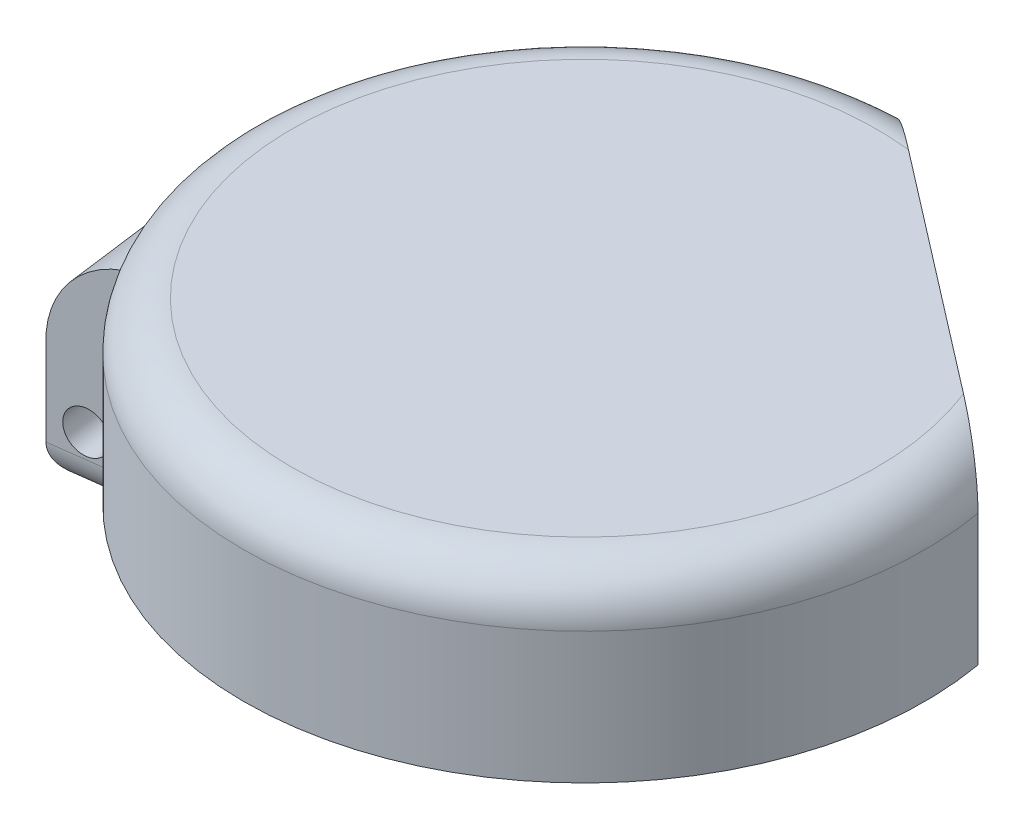
ISO-10303-21;
HEADER;
FILE_DESCRIPTION(('STEP AP214'),'2;1');
FILE_NAME('part.step','',(''),(''),'','','');
FILE_SCHEMA(('AUTOMOTIVE_DESIGN { 1 0 10303 214 1 1 1 1 }'));
ENDSEC;
DATA;
#1=APPLICATION_CONTEXT('core data for automotive mechanical design processes');
#2=APPLICATION_PROTOCOL_DEFINITION('international standard','automotive_design',2000,#1);
#3=PRODUCT_CONTEXT('',#1,'mechanical');
#4=PRODUCT('Part','Part','',(#3));
#5=PRODUCT_RELATED_PRODUCT_CATEGORY('part','',(#4));
#6=PRODUCT_DEFINITION_FORMATION('','',#4);
#7=PRODUCT_DEFINITION_CONTEXT('part definition',#1,'design');
#8=PRODUCT_DEFINITION('design','',#6,#7);
#9=PRODUCT_DEFINITION_SHAPE('','',#8);
#10=(LENGTH_UNIT() NAMED_UNIT(*) SI_UNIT(.MILLI.,.METRE.));
#11=(NAMED_UNIT(*) PLANE_ANGLE_UNIT() SI_UNIT($,.RADIAN.));
#12=(NAMED_UNIT(*) SI_UNIT($,.STERADIAN.) SOLID_ANGLE_UNIT());
#13=UNCERTAINTY_MEASURE_WITH_UNIT(LENGTH_MEASURE(1.E-05),#10,'distance_accuracy_value','');
#14=(GEOMETRIC_REPRESENTATION_CONTEXT(3) GLOBAL_UNCERTAINTY_ASSIGNED_CONTEXT((#13)) GLOBAL_UNIT_ASSIGNED_CONTEXT((#10,
#11,#12)) REPRESENTATION_CONTEXT('',''));
#15=CARTESIAN_POINT('',(0.,0.,0.));
#16=DIRECTION('',(0.,0.,1.));
#17=DIRECTION('',(1.,0.,0.));
#18=AXIS2_PLACEMENT_3D('',#15,#16,#17);
#19=CARTESIAN_POINT('',(0.,15.,0.));
#20=DIRECTION('',(0.,-1.,0.));
#21=DIRECTION('',(0.,0.,-1.));
#22=AXIS2_PLACEMENT_3D('',#19,#20,#21);
#23=CYLINDRICAL_SURFACE('',#22,28.4999999999886);
#24=DIRECTION('',(0.,-1.,0.));
#25=VECTOR('',#24,1.);
#26=CARTESIAN_POINT('',(28.0773849307796,15.,-4.88983184252586));
#27=LINE('',#26,#25);
#28=CARTESIAN_POINT('',(28.0773849307796,11.,-4.88983184252586));
#29=VERTEX_POINT('',#28);
#30=CARTESIAN_POINT('',(28.0773849307796,0.,-4.88983184252586));
#31=VERTEX_POINT('',#30);
#32=EDGE_CURVE('E285',#29,#31,#27,.T.);
#33=ORIENTED_EDGE('',*,*,#32,.F.);
#34=CARTESIAN_POINT('',(0.,11.,0.));
#35=DIRECTION('',(0.,1.,0.));
#36=DIRECTION('',(0.,0.,1.));
#37=AXIS2_PLACEMENT_3D('',#34,#35,#36);
#38=CIRCLE('',#37,28.4999999999886);
#39=CARTESIAN_POINT('',(-2.46069205317304,11.,-28.393573121726));
#40=VERTEX_POINT('',#39);
#41=EDGE_CURVE('E354',#29,#40,#38,.F.);
#42=ORIENTED_EDGE('',*,*,#41,.T.);
#43=DIRECTION('',(0.,-1.,0.));
#44=VECTOR('',#43,1.);
#45=CARTESIAN_POINT('',(-2.46069205317304,15.,-28.393573121726));
#46=LINE('',#45,#44);
#47=CARTESIAN_POINT('',(-2.46069205317304,0.,-28.393573121726));
#48=VERTEX_POINT('',#47);
#49=EDGE_CURVE('E292',#40,#48,#46,.T.);
#50=ORIENTED_EDGE('',*,*,#49,.T.);
#51=CARTESIAN_POINT('',(0.,0.,0.));
#52=DIRECTION('',(0.,1.,0.));
#53=DIRECTION('',(0.,0.,1.));
#54=AXIS2_PLACEMENT_3D('',#51,#52,#53);
#55=CIRCLE('',#54,28.4999999999886);
#56=EDGE_CURVE('E286',#48,#31,#55,.T.);
#57=ORIENTED_EDGE('',*,*,#56,.T.);
#58=EDGE_LOOP('',(#33,#42,#50,#57));
#59=FACE_BOUND('',#58,.T.);
#60=DIRECTION('',(0.,-1.,0.));
#61=VECTOR('',#60,1.);
#62=CARTESIAN_POINT('',(-28.1278529108762,15.,-4.59063074353197));
#63=LINE('',#62,#61);
#64=CARTESIAN_POINT('',(-28.1278529108762,8.13280866111372,-4.59063074353197));
#65=VERTEX_POINT('',#64);
#66=CARTESIAN_POINT('',(-28.1278529108762,2.13280866111373,-4.59063074353197));
#67=VERTEX_POINT('',#66);
#68=EDGE_CURVE('E184',#65,#67,#63,.T.);
#69=ORIENTED_EDGE('',*,*,#68,.F.);
#70=CARTESIAN_POINT('',(0.,8.13280866111369,0.));
#71=DIRECTION('',(0.,-1.,0.));
#72=DIRECTION('',(1.,0.,0.));
#73=AXIS2_PLACEMENT_3D('',#70,#71,#72);
#74=CIRCLE('',#73,28.4999999999886);
#75=CARTESIAN_POINT('',(-28.2615823921877,8.13280866111373,3.67871726134734));
#76=VERTEX_POINT('',#75);
#77=EDGE_CURVE('E369',#76,#65,#74,.T.);
#78=ORIENTED_EDGE('',*,*,#77,.F.);
#79=CARTESIAN_POINT('',(-26.6925412667941,8.13280866111374,9.98790472120371));
#80=VERTEX_POINT('',#79);
#81=EDGE_CURVE('E366',#80,#76,#74,.T.);
#82=ORIENTED_EDGE('',*,*,#81,.F.);
#83=DIRECTION('',(0.,-1.,0.));
#84=VECTOR('',#83,1.);
#85=CARTESIAN_POINT('',(-26.6925412667941,15.,9.9879047212037));
#86=LINE('',#85,#84);
#87=CARTESIAN_POINT('',(-26.6925412667941,2.13280866111374,9.9879047212037));
#88=VERTEX_POINT('',#87);
#89=EDGE_CURVE('E359',#80,#88,#86,.T.);
#90=ORIENTED_EDGE('',*,*,#89,.T.);
#91=CARTESIAN_POINT('',(0.,2.13280866111375,0.));
#92=DIRECTION('',(0.,1.,0.));
#93=DIRECTION('',(-1.,0.,0.));
#94=AXIS2_PLACEMENT_3D('',#91,#92,#93);
#95=CIRCLE('',#94,28.4999999999886);
#96=CARTESIAN_POINT('',(-28.2615823921877,2.13280866111373,3.67871726134734));
#97=VERTEX_POINT('',#96);
#98=EDGE_CURVE('E361',#97,#88,#95,.T.);
#99=ORIENTED_EDGE('',*,*,#98,.F.);
#100=EDGE_CURVE('E367',#67,#97,#95,.T.);
#101=ORIENTED_EDGE('',*,*,#100,.F.);
#102=EDGE_LOOP('',(#69,#78,#82,#90,#99,#101));
#103=FACE_BOUND('',#102,.T.);
#104=ADVANCED_FACE('F39',(#59,#103),#23,.T.);
#105=CARTESIAN_POINT('',(23.1864899240637,15.,-8.65412685435615));
#106=DIRECTION('',(-0.609921258990632,0.,0.792462022958377));
#107=DIRECTION('',(0.792462022958377,0.,0.609921258990632));
#108=AXIS2_PLACEMENT_3D('',#105,#106,#107);
#109=PLANE('',#108);
#110=DIRECTION('',(-0.792462022958376,0.,-0.609921258990633));
#111=VECTOR('',#110,1.);
#112=CARTESIAN_POINT('',(23.1864899240637,15.,-8.65412685435615));
#113=LINE('',#112,#111);
#114=CARTESIAN_POINT('',(22.8087650405059,15.,-8.94484417563749));
#115=VERTEX_POINT('',#114);
#116=CARTESIAN_POINT('',(2.80792783710069,15.,-24.3385607886143));
#117=VERTEX_POINT('',#116);
#118=EDGE_CURVE('E282',#115,#117,#113,.T.);
#119=ORIENTED_EDGE('',*,*,#118,.F.);
#120=CARTESIAN_POINT('',(22.8087650405059,15.,-8.94484417563749));
#121=CARTESIAN_POINT('',(22.9197151819075,14.9999966218736,-8.85945099846509));
#122=CARTESIAN_POINT('',(23.030662100096,14.9980499476528,-8.77406030205036));
#123=CARTESIAN_POINT('',(23.2524842215523,14.9899576648635,-8.60333410486868));
#124=CARTESIAN_POINT('',(23.3633594022338,14.9838110830384,-8.51799862148532));
#125=CARTESIAN_POINT('',(23.6964778755162,14.9585451580046,-8.26161278502726));
#126=CARTESIAN_POINT('',(23.9184357633951,14.9325951780306,-8.09078209472793));
#127=CARTESIAN_POINT('',(24.3634352939433,14.8591378204923,-7.74828659833935));
#128=CARTESIAN_POINT('',(24.5864454900354,14.8113214027466,-7.57664599522194));
#129=CARTESIAN_POINT('',(25.027948014718,14.6906226623751,-7.23684198203192));
#130=CARTESIAN_POINT('',(25.2464471832023,14.6177817790417,-7.06867330761033));
#131=CARTESIAN_POINT('',(25.5690157731485,14.4865492406019,-6.82040722697676));
#132=CARTESIAN_POINT('',(25.6758833788836,14.4390262284403,-6.73815618812956));
#133=CARTESIAN_POINT('',(25.8872000304859,14.3360850746214,-6.57551556377537));
#134=CARTESIAN_POINT('',(25.9916488817492,14.280666300249,-6.49512612804593));
#135=CARTESIAN_POINT('',(26.2998023173756,14.1020205169576,-6.25795472301396));
#136=CARTESIAN_POINT('',(26.4991100296383,13.9660923303716,-6.10455682220851));
#137=CARTESIAN_POINT('',(26.8470589684213,13.6813822138625,-5.83675666439812));
#138=CARTESIAN_POINT('',(26.9986462283465,13.5383747072633,-5.72008698213958));
#139=CARTESIAN_POINT('',(27.2818858247614,13.2234515219114,-5.50209060346588));
#140=CARTESIAN_POINT('',(27.4135595559255,13.0515672930293,-5.4007474405623));
#141=CARTESIAN_POINT('',(27.6183868834771,12.7266417335124,-5.24310134790839));
#142=CARTESIAN_POINT('',(27.6978919641955,12.5800435610043,-5.18190997529616));
#143=CARTESIAN_POINT('',(27.8021583656245,12.3496148814372,-5.10166096274085));
#144=CARTESIAN_POINT('',(27.8343989233107,12.2711054623945,-5.0768469010384));
#145=CARTESIAN_POINT('',(27.8934180514728,12.1108996479084,-5.03142261582308));
#146=CARTESIAN_POINT('',(27.9201992570465,12.0292048127812,-5.01081036419771));
#147=CARTESIAN_POINT('',(27.9656342771095,11.8707478106625,-4.97584113685775));
#148=CARTESIAN_POINT('',(27.9848091077193,11.7942232157571,-4.96108315920379));
#149=CARTESIAN_POINT('',(28.0179544516386,11.6394055753678,-4.93557272550817));
#150=CARTESIAN_POINT('',(28.031925874673,11.5611128415532,-4.92481956929358));
#151=CARTESIAN_POINT('',(28.0544984312568,11.4027067311063,-4.90744651956835));
#152=CARTESIAN_POINT('',(28.0630594592146,11.3225842168674,-4.90085749347117));
#153=CARTESIAN_POINT('',(28.0745140399743,11.1616449238521,-4.89204143400617));
#154=CARTESIAN_POINT('',(28.0774038373428,11.0808277206052,-4.88981729102119));
#155=CARTESIAN_POINT('',(28.0773849307796,11.,-4.88983184252585));
#156=B_SPLINE_CURVE_WITH_KNOTS('',3,(#120,#121,#122,#123,#124,#125,#126,#127,#128,#129,#130,
#131,#132,#133,#134,#135,#136,#137,#138,#139,#140,#141,#142,#143,#144,#145,#146,#147,#148,#149,
#150,#151,#152,#153,#154,#155),.UNSPECIFIED.,.F.,.F.,(4,2,2,2,2,2,2,2,2,2,2,2,2,2,2,2,2,4),(0.,
0.419993858932493,0.840085077265771,1.68320900562935,2.53863580132238,3.39265282596669,
3.82137630782058,4.25013416413614,5.10451429020874,5.81862018224171,6.53195331867824,
7.06264908846479,7.32764680496837,7.5925163090072,7.83302011446851,8.07348185228879,
8.31570577354576,8.55809003906211),.UNSPECIFIED.);
#157=EDGE_CURVE('E305',#115,#29,#156,.T.);
#158=ORIENTED_EDGE('',*,*,#157,.T.);
#159=ORIENTED_EDGE('',*,*,#32,.T.);
#160=DIRECTION('',(-0.792462022958377,0.,-0.609921258990632));
#161=VECTOR('',#160,1.);
#162=CARTESIAN_POINT('',(23.1864899240637,0.,-8.65412685435615));
#163=LINE('',#162,#161);
#164=EDGE_CURVE('E275',#31,#48,#163,.T.);
#165=ORIENTED_EDGE('',*,*,#164,.T.);
#166=ORIENTED_EDGE('',*,*,#49,.F.);
#167=CARTESIAN_POINT('',(-2.46069205317304,11.,-28.393573121726));
#168=CARTESIAN_POINT('',(-2.4607156423846,11.0862161322655,-28.3935912772479));
#169=CARTESIAN_POINT('',(-2.45742550100494,11.1724161815989,-28.3910590080483));
#170=CARTESIAN_POINT('',(-2.44439928729485,11.3439734980434,-28.381033335605));
#171=CARTESIAN_POINT('',(-2.43466811258324,11.4293313555279,-28.3735437018313));
#172=CARTESIAN_POINT('',(-2.40904974542677,11.5978108015038,-28.3538264329948));
#173=CARTESIAN_POINT('',(-2.39321535921455,11.6809452033704,-28.3416394404398));
#174=CARTESIAN_POINT('',(-2.35571771865815,11.84507755699,-28.3127792459135));
#175=CARTESIAN_POINT('',(-2.33405368104359,11.9260752200443,-28.2961054410952));
#176=CARTESIAN_POINT('',(-2.26101925867176,12.164563045356,-28.2398942340567));
#177=CARTESIAN_POINT('',(-2.20150577539929,12.3181837739575,-28.1940894666447));
#178=CARTESIAN_POINT('',(-2.06433970649324,12.6120540336859,-28.0885191061551));
#179=CARTESIAN_POINT('',(-1.98664642733391,12.7522725588133,-28.0287221931585));
#180=CARTESIAN_POINT('',(-1.78230805037165,13.0718455951133,-27.8714524230922));
#181=CARTESIAN_POINT('',(-1.64859150859841,13.2439955949161,-27.768537003623));
#182=CARTESIAN_POINT('',(-1.36120145108757,13.559062087377,-27.5473462075719));
#183=CARTESIAN_POINT('',(-1.20750022600024,13.7019372676517,-27.429049504389));
#184=CARTESIAN_POINT('',(-0.927292090048359,13.9277245569317,-27.2133863002127));
#185=CARTESIAN_POINT('',(-0.803762449459978,14.0166573365107,-27.1183112660438));
#186=CARTESIAN_POINT('',(-0.550977936804274,14.1806062060654,-26.923754752614));
#187=CARTESIAN_POINT('',(-0.421720083057594,14.2556149402761,-26.8242709784929));
#188=CARTESIAN_POINT('',(-0.158460138519076,14.3931262216248,-26.6216520110686));
#189=CARTESIAN_POINT('',(-0.0244395147322575,14.455571701349,-26.5185025537791));
#190=CARTESIAN_POINT('',(0.24669788349581,14.5686977449325,-26.3098206756629));
#191=CARTESIAN_POINT('',(0.383815570205059,14.6193747913667,-26.2042875527059));
#192=CARTESIAN_POINT('',(0.709709094653672,14.7262288220219,-25.9534624242202));
#193=CARTESIAN_POINT('',(0.899414930951102,14.7778863854278,-25.8074546419413));
#194=CARTESIAN_POINT('',(1.28136414768974,14.8638483663483,-25.5134860473655));
#195=CARTESIAN_POINT('',(1.47360932582749,14.8981397302905,-25.3655238514651));
#196=CARTESIAN_POINT('',(1.85614305906951,14.9509737715118,-25.0711053816508));
#197=CARTESIAN_POINT('',(2.04641017150667,14.9697715254074,-24.9246656111631));
#198=CARTESIAN_POINT('',(2.42712138211621,14.9942541931097,-24.6316498524774));
#199=CARTESIAN_POINT('',(2.61756444759768,14.9999640915793,-24.4850746590935));
#200=CARTESIAN_POINT('',(2.80792783710067,15.,-24.3385607886143));
#201=B_SPLINE_CURVE_WITH_KNOTS('',3,(#167,#168,#169,#170,#171,#172,#173,#174,#175,#176,#177,
#178,#179,#180,#181,#182,#183,#184,#185,#186,#187,#188,#189,#190,#191,#192,#193,#194,#195,#196,
#197,#198,#199,#200),.UNSPECIFIED.,.F.,.F.,(4,2,2,2,2,2,2,2,2,2,2,2,2,2,2,2,4),(0.,
0.258522296473451,0.516848243804886,0.772987533788175,1.02916125577529,1.53959039014347,
2.05117318362961,2.7703261211216,3.49048703581486,4.02817460031106,4.56614540988481,
5.10650731134746,5.64703051237305,6.38094554411315,7.11541141867153,7.83752935623398,
8.55826762137591),.UNSPECIFIED.);
#202=EDGE_CURVE('E297',#40,#117,#201,.T.);
#203=ORIENTED_EDGE('',*,*,#202,.T.);
#204=EDGE_LOOP('',(#119,#158,#159,#165,#166,#203));
#205=FACE_BOUND('',#204,.T.);
#206=ADVANCED_FACE('F313',(#205),#109,.F.);
#207=CARTESIAN_POINT('',(0.,15.,0.));
#208=DIRECTION('',(0.,1.,0.));
#209=DIRECTION('',(0.,0.,1.));
#210=AXIS2_PLACEMENT_3D('',#207,#208,#209);
#211=PLANE('',#210);
#212=ORIENTED_EDGE('',*,*,#118,.T.);
#213=CARTESIAN_POINT('',(0.,15.,0.));
#214=DIRECTION('',(0.,1.,0.));
#215=DIRECTION('',(0.,0.,1.));
#216=AXIS2_PLACEMENT_3D('',#213,#214,#215);
#217=CIRCLE('',#216,24.4999999999886);
#218=EDGE_CURVE('E294',#117,#115,#217,.T.);
#219=ORIENTED_EDGE('',*,*,#218,.T.);
#220=EDGE_LOOP('',(#212,#219));
#221=FACE_BOUND('',#220,.T.);
#222=ADVANCED_FACE('F317',(#221),#211,.T.);
#223=CARTESIAN_POINT('',(0.,0.,0.));
#224=DIRECTION('',(0.,1.,0.));
#225=DIRECTION('',(0.,0.,1.));
#226=AXIS2_PLACEMENT_3D('',#223,#224,#225);
#227=PLANE('',#226);
#228=CARTESIAN_POINT('',(0.,0.,0.));
#229=DIRECTION('',(0.,1.,0.));
#230=DIRECTION('',(0.,0.,1.));
#231=AXIS2_PLACEMENT_3D('',#228,#229,#230);
#232=CIRCLE('',#231,26.4999999999886);
#233=CARTESIAN_POINT('',(-3.05060994356709,0.,-26.323825310384));
#234=VERTEX_POINT('',#233);
#235=CARTESIAN_POINT('',(26.2276177852111,0.,-3.78973156203436));
#236=VERTEX_POINT('',#235);
#237=EDGE_CURVE('E242',#234,#236,#232,.T.);
#238=ORIENTED_EDGE('',*,*,#237,.T.);
#239=DIRECTION('',(-0.792462022958377,0.,-0.609921258990632));
#240=VECTOR('',#239,1.);
#241=CARTESIAN_POINT('',(21.9666474060824,0.,-7.06920280843939));
#242=LINE('',#241,#240);
#243=EDGE_CURVE('E237',#236,#234,#242,.T.);
#244=ORIENTED_EDGE('',*,*,#243,.T.);
#245=EDGE_LOOP('',(#238,#244));
#246=FACE_BOUND('',#245,.T.);
#247=ORIENTED_EDGE('',*,*,#164,.F.);
#248=ORIENTED_EDGE('',*,*,#56,.F.);
#249=EDGE_LOOP('',(#247,#248));
#250=FACE_BOUND('',#249,.T.);
#251=ADVANCED_FACE('F323',(#246,#250),#227,.F.);
#252=CARTESIAN_POINT('',(0.,11.,0.));
#253=DIRECTION('',(0.,1.,0.));
#254=DIRECTION('',(0.,0.,1.));
#255=AXIS2_PLACEMENT_3D('',#252,#253,#254);
#256=TOROIDAL_SURFACE('',#255,24.4999999999886,4.);
#257=ORIENTED_EDGE('',*,*,#202,.F.);
#258=ORIENTED_EDGE('',*,*,#41,.F.);
#259=ORIENTED_EDGE('',*,*,#157,.F.);
#260=ORIENTED_EDGE('',*,*,#218,.F.);
#261=EDGE_LOOP('',(#257,#258,#259,#260));
#262=FACE_BOUND('',#261,.T.);
#263=ADVANCED_FACE('F262',(#262),#256,.T.);
#264=CARTESIAN_POINT('',(21.9666474060824,15.,-7.06920280843939));
#265=DIRECTION('',(-0.609921258990632,0.,0.792462022958377));
#266=DIRECTION('',(0.792462022958377,0.,0.609921258990632));
#267=AXIS2_PLACEMENT_3D('',#264,#265,#266);
#268=PLANE('',#267);
#269=DIRECTION('',(-0.792462022958377,0.,-0.609921258990632));
#270=VECTOR('',#269,1.);
#271=CARTESIAN_POINT('',(21.9666474060824,13.,-7.06920280843939));
#272=LINE('',#271,#270);
#273=CARTESIAN_POINT('',(23.8460753293753,13.,-5.62269431724683));
#274=VERTEX_POINT('',#273);
#275=CARTESIAN_POINT('',(-0.669067487731261,13.,-24.4908625551715));
#276=VERTEX_POINT('',#275);
#277=EDGE_CURVE('E238',#274,#276,#272,.T.);
#278=ORIENTED_EDGE('',*,*,#277,.T.);
#279=CARTESIAN_POINT('',(-3.05060994356694,11.,-26.3238253103838));
#280=CARTESIAN_POINT('',(-3.05062192891782,11.0441799840185,-26.3238345349524));
#281=CARTESIAN_POINT('',(-3.04894617485477,11.0883517947644,-26.3225447847836));
#282=CARTESIAN_POINT('',(-3.04231142916089,11.1762687258008,-26.3174383287902));
#283=CARTESIAN_POINT('',(-3.03735490515546,11.2200141417292,-26.3136235221824));
#284=CARTESIAN_POINT('',(-3.02430510249928,11.3063748204567,-26.3035796944215));
#285=CARTESIAN_POINT('',(-3.01623825550609,11.3489964568119,-26.2973710164892));
#286=CARTESIAN_POINT('',(-2.99713388198368,11.4331578726252,-26.282667266387));
#287=CARTESIAN_POINT('',(-2.98609595631552,11.4746975059026,-26.2741718870185));
#288=CARTESIAN_POINT('',(-2.94888084982836,11.5970355258032,-26.2455291458593));
#289=CARTESIAN_POINT('',(-2.91855170812935,11.6758744237359,-26.222186212377));
#290=CARTESIAN_POINT('',(-2.84862997807775,11.8267702156673,-26.1683707002283));
#291=CARTESIAN_POINT('',(-2.80901701591134,11.8988116975381,-26.1378824407825));
#292=CARTESIAN_POINT('',(-2.70493966783357,12.0628441078187,-26.057778933822));
#293=CARTESIAN_POINT('',(-2.63688669268729,12.1512121424039,-26.0054017156377));
#294=CARTESIAN_POINT('',(-2.49049927462438,12.3130159955285,-25.8927341104545));
#295=CARTESIAN_POINT('',(-2.41214847460372,12.3864275738697,-25.8324311341515));
#296=CARTESIAN_POINT('',(-2.21274883365481,12.5480311678447,-25.6789624801006));
#297=CARTESIAN_POINT('',(-2.08793599003354,12.6287927888525,-25.5828998240815));
#298=CARTESIAN_POINT('',(-1.82964938673184,12.7648529317691,-25.384108606708));
#299=CARTESIAN_POINT('',(-1.69614631924579,12.8200595912822,-25.2813574884951));
#300=CARTESIAN_POINT('',(-1.48737128000538,12.8874764283821,-25.1206730252776));
#301=CARTESIAN_POINT('',(-1.41365300472767,12.9077722316882,-25.0639354883794));
#302=CARTESIAN_POINT('',(-1.26528590450886,12.9421575508653,-24.9497442136727));
#303=CARTESIAN_POINT('',(-1.19063685472373,12.9562455360506,-24.8922903028122));
#304=CARTESIAN_POINT('',(-1.04159261775132,12.9784204882508,-24.7775778673568));
#305=CARTESIAN_POINT('',(-0.967203090808133,12.9865693267509,-24.7203236991891));
#306=CARTESIAN_POINT('',(-0.818227820001025,12.9973518321355,-24.605664343792));
#307=CARTESIAN_POINT('',(-0.743642267005306,12.9999896640448,-24.5482593034648));
#308=CARTESIAN_POINT('',(-0.669067487731263,13.,-24.4908625551715));
#309=B_SPLINE_CURVE_WITH_KNOTS('',3,(#279,#280,#281,#282,#283,#284,#285,#286,#287,#288,#289,
#290,#291,#292,#293,#294,#295,#296,#297,#298,#299,#300,#301,#302,#303,#304,#305,#306,#307,#308),
.UNSPECIFIED.,.F.,.F.,(4,2,2,2,2,2,2,2,2,2,2,2,2,2,4),(0.,0.132476057291732,0.2648525860014,
0.396128122094714,0.527421302739257,0.789037935508019,1.05123416607199,1.41883590308456,
1.78702876071363,2.31514960460713,2.84515441682478,3.13061450817555,3.41614494718434,
3.69865659339618,3.98095464989214),.UNSPECIFIED.);
#310=CARTESIAN_POINT('',(-3.05060994356694,11.,-26.3238253103838));
#311=VERTEX_POINT('',#310);
#312=EDGE_CURVE('E252',#311,#276,#309,.T.);
#313=ORIENTED_EDGE('',*,*,#312,.F.);
#314=DIRECTION('',(0.,-1.,0.));
#315=VECTOR('',#314,1.);
#316=CARTESIAN_POINT('',(-3.05060994356694,11.,-26.3238253103838));
#317=LINE('',#316,#315);
#318=EDGE_CURVE('E273',#311,#234,#317,.T.);
#319=ORIENTED_EDGE('',*,*,#318,.T.);
#320=ORIENTED_EDGE('',*,*,#243,.F.);
#321=DIRECTION('',(0.,-1.,0.));
#322=VECTOR('',#321,1.);
#323=CARTESIAN_POINT('',(26.227617785211,11.,-3.78973156203448));
#324=LINE('',#323,#322);
#325=CARTESIAN_POINT('',(26.227617785211,11.,-3.78973156203448));
#326=VERTEX_POINT('',#325);
#327=EDGE_CURVE('E241',#326,#236,#324,.T.);
#328=ORIENTED_EDGE('',*,*,#327,.F.);
#329=CARTESIAN_POINT('',(23.8460753293753,13.,-5.62269431724683));
#330=CARTESIAN_POINT('',(23.947847059887,12.9999640373081,-5.54436533717577));
#331=CARTESIAN_POINT('',(24.0496687011148,12.9950655806302,-5.46599794314182));
#332=CARTESIAN_POINT('',(24.2529723321722,12.9748123601077,-5.30952456899953));
#333=CARTESIAN_POINT('',(24.3544522324551,12.9594246085679,-5.23142019711842));
#334=CARTESIAN_POINT('',(24.5573024924751,12.9171773469008,-5.07529576163309));
#335=CARTESIAN_POINT('',(24.6586539388865,12.8901699442398,-4.99729025473824));
#336=CARTESIAN_POINT('',(24.8586343585462,12.8237032124014,-4.84337460225437));
#337=CARTESIAN_POINT('',(24.957267111746,12.7842622300304,-4.76746154741198));
#338=CARTESIAN_POINT('',(25.158857763508,12.6877048388137,-4.6123065739731));
#339=CARTESIAN_POINT('',(25.2614514985939,12.6293543627798,-4.53334493511185));
#340=CARTESIAN_POINT('',(25.4587896955666,12.4949571304712,-4.38146287886489));
#341=CARTESIAN_POINT('',(25.553561798887,12.4189766585352,-4.30852118714998));
#342=CARTESIAN_POINT('',(25.7131414214584,12.2653519114488,-4.18570015410589));
#343=CARTESIAN_POINT('',(25.7800968787724,12.1912856110106,-4.13416764448627));
#344=CARTESIAN_POINT('',(25.9038475062829,12.0305382887848,-4.03892252693437));
#345=CARTESIAN_POINT('',(25.9606516138359,11.9438684864259,-3.99520304033339));
#346=CARTESIAN_POINT('',(26.0497747928084,11.7784844951497,-3.92660906365141));
#347=CARTESIAN_POINT('',(26.0847322875536,11.7020416555892,-3.89970390152571));
#348=CARTESIAN_POINT('',(26.1441690705502,11.5429920820236,-3.85395816675809));
#349=CARTESIAN_POINT('',(26.1686709540844,11.4603990975872,-3.83510020357517));
#350=CARTESIAN_POINT('',(26.2003978102153,11.3146892257521,-3.81068151413066));
#351=CARTESIAN_POINT('',(26.2105360259528,11.2525693718237,-3.80287859976079));
#352=CARTESIAN_POINT('',(26.2241777016399,11.1269902339857,-3.79237923478337));
#353=CARTESIAN_POINT('',(26.2276604599641,11.0635273896229,-3.78969871725651));
#354=CARTESIAN_POINT('',(26.227617785211,11.,-3.78973156203447));
#355=B_SPLINE_CURVE_WITH_KNOTS('',3,(#329,#330,#331,#332,#333,#334,#335,#336,#337,#338,#339,
#340,#341,#342,#343,#344,#345,#346,#347,#348,#349,#350,#351,#352,#353,#354),.UNSPECIFIED.,.F.,
.F.,(4,2,2,2,2,2,2,2,2,2,2,2,4),(0.,0.385277433698497,0.771772147428757,1.16333878304289,
1.55433031208302,1.97915161957025,2.4024008706592,2.73832063833832,3.07394318581555,
3.33768816533516,3.60086025160084,3.79059008129184,3.98090910611712),.UNSPECIFIED.);
#356=EDGE_CURVE('E243',#274,#326,#355,.T.);
#357=ORIENTED_EDGE('',*,*,#356,.F.);
#358=EDGE_LOOP('',(#278,#313,#319,#320,#328,#357));
#359=FACE_BOUND('',#358,.T.);
#360=ADVANCED_FACE('F257',(#359),#268,.T.);
#361=CARTESIAN_POINT('',(0.,15.,0.));
#362=DIRECTION('',(0.,-1.,0.));
#363=DIRECTION('',(0.,0.,-1.));
#364=AXIS2_PLACEMENT_3D('',#361,#362,#363);
#365=CYLINDRICAL_SURFACE('',#364,26.4999999999886);
#366=ORIENTED_EDGE('',*,*,#327,.T.);
#367=ORIENTED_EDGE('',*,*,#237,.F.);
#368=ORIENTED_EDGE('',*,*,#318,.F.);
#369=CARTESIAN_POINT('',(0.,11.,0.));
#370=DIRECTION('',(0.,-1.,0.));
#371=DIRECTION('',(0.,0.,-1.));
#372=AXIS2_PLACEMENT_3D('',#369,#370,#371);
#373=CIRCLE('',#372,26.4999999999886);
#374=EDGE_CURVE('E251',#326,#311,#373,.T.);
#375=ORIENTED_EDGE('',*,*,#374,.F.);
#376=EDGE_LOOP('',(#366,#367,#368,#375));
#377=FACE_BOUND('',#376,.T.);
#378=ADVANCED_FACE('F261',(#377),#365,.F.);
#379=CARTESIAN_POINT('',(0.,13.,0.));
#380=DIRECTION('',(0.,1.,0.));
#381=DIRECTION('',(0.,0.,1.));
#382=AXIS2_PLACEMENT_3D('',#379,#380,#381);
#383=PLANE('',#382);
#384=ORIENTED_EDGE('',*,*,#277,.F.);
#385=CARTESIAN_POINT('',(0.,13.,0.));
#386=DIRECTION('',(0.,1.,0.));
#387=DIRECTION('',(0.,0.,1.));
#388=AXIS2_PLACEMENT_3D('',#385,#386,#387);
#389=CIRCLE('',#388,24.4999999999886);
#390=EDGE_CURVE('E272',#276,#274,#389,.T.);
#391=ORIENTED_EDGE('',*,*,#390,.F.);
#392=EDGE_LOOP('',(#384,#391));
#393=FACE_BOUND('',#392,.T.);
#394=ADVANCED_FACE('F329',(#393),#383,.F.);
#395=CARTESIAN_POINT('',(0.,11.,0.));
#396=DIRECTION('',(0.,1.,0.));
#397=DIRECTION('',(0.,0.,1.));
#398=AXIS2_PLACEMENT_3D('',#395,#396,#397);
#399=TOROIDAL_SURFACE('',#398,24.4999999999886,2.);
#400=ORIENTED_EDGE('',*,*,#312,.T.);
#401=ORIENTED_EDGE('',*,*,#390,.T.);
#402=ORIENTED_EDGE('',*,*,#356,.T.);
#403=ORIENTED_EDGE('',*,*,#374,.T.);
#404=EDGE_LOOP('',(#400,#401,#402,#403));
#405=FACE_BOUND('',#404,.T.);
#406=ADVANCED_FACE('F254',(#405),#399,.F.);
#407=CARTESIAN_POINT('',(-26.2379157701977,2.13280866111374,9.9287276150329));
#408=DIRECTION('',(-0.99163446990172,0.,0.129077798643818));
#409=DIRECTION('',(0.129077798643818,0.,0.99163446990172));
#410=AXIS2_PLACEMENT_3D('',#407,#408,#409);
#411=PLANE('',#410);
#412=DIRECTION('',(-0.129077798643818,0.,-0.99163446990172));
#413=VECTOR('',#412,1.);
#414=CARTESIAN_POINT('',(-26.2379157701977,8.13280866111374,9.9287276150329));
#415=LINE('',#414,#413);
#416=CARTESIAN_POINT('',(-28.174082749855,8.13280866111372,-4.94578943349291));
#417=VERTEX_POINT('',#416);
#418=EDGE_CURVE('E82',#65,#417,#415,.T.);
#419=ORIENTED_EDGE('',*,*,#418,.F.);
#420=ORIENTED_EDGE('',*,*,#68,.T.);
#421=DIRECTION('',(-0.129077798643818,0.,-0.99163446990172));
#422=VECTOR('',#421,1.);
#423=CARTESIAN_POINT('',(-26.2379157701977,2.13280866111374,9.9287276150329));
#424=LINE('',#423,#422);
#425=CARTESIAN_POINT('',(-28.174082749855,2.13280866111373,-4.94578943349291));
#426=VERTEX_POINT('',#425);
#427=EDGE_CURVE('E204',#67,#426,#424,.T.);
#428=ORIENTED_EDGE('',*,*,#427,.T.);
#429=DIRECTION('',(0.,1.,0.));
#430=VECTOR('',#429,1.);
#431=CARTESIAN_POINT('',(-28.174082749855,2.13280866111373,-4.94578943349291));
#432=LINE('',#431,#430);
#433=EDGE_CURVE('E205',#426,#417,#432,.T.);
#434=ORIENTED_EDGE('',*,*,#433,.T.);
#435=EDGE_LOOP('',(#419,#420,#428,#434));
#436=FACE_BOUND('',#435,.T.);
#437=ADVANCED_FACE('F336',(#436),#411,.F.);
#438=CARTESIAN_POINT('',(-26.2379157701977,8.13280866111374,9.9287276150329));
#439=DIRECTION('',(0.,-1.,0.));
#440=DIRECTION('',(1.,0.,0.));
#441=AXIS2_PLACEMENT_3D('',#438,#439,#440);
#442=PLANE('',#441);
#443=DIRECTION('',(-0.99163446990172,0.,0.129077798643818));
#444=VECTOR('',#443,1.);
#445=CARTESIAN_POINT('',(-26.2379157701977,8.13280866111374,9.9287276150329));
#446=LINE('',#445,#444);
#447=CARTESIAN_POINT('',(-27.4278771340798,8.13280866111374,10.0836209734055));
#448=VERTEX_POINT('',#447);
#449=EDGE_CURVE('E196',#80,#448,#446,.T.);
#450=ORIENTED_EDGE('',*,*,#449,.F.);
#451=ORIENTED_EDGE('',*,*,#81,.T.);
#452=DIRECTION('',(-0.129077798643818,0.,-0.99163446990172));
#453=VECTOR('',#452,1.);
#454=CARTESIAN_POINT('',(-27.4278771340798,8.13280866111374,10.0836209734055));
#455=LINE('',#454,#453);
#456=EDGE_CURVE('E233',#448,#76,#455,.T.);
#457=ORIENTED_EDGE('',*,*,#456,.F.);
#458=EDGE_LOOP('',(#450,#451,#457));
#459=FACE_BOUND('',#458,.T.);
#460=ADVANCED_FACE('F386',(#459),#442,.F.);
#461=CARTESIAN_POINT('',(-27.4278771340798,2.13280866111374,10.0836209734055));
#462=DIRECTION('',(0.,1.,0.));
#463=DIRECTION('',(-1.,0.,0.));
#464=AXIS2_PLACEMENT_3D('',#461,#462,#463);
#465=PLANE('',#464);
#466=DIRECTION('',(-0.129077798643818,0.,-0.99163446990172));
#467=VECTOR('',#466,1.);
#468=CARTESIAN_POINT('',(-27.4278771340798,2.13280866111374,10.0836209734055));
#469=LINE('',#468,#467);
#470=CARTESIAN_POINT('',(-27.4278771340798,2.13280866111374,10.0836209734055));
#471=VERTEX_POINT('',#470);
#472=EDGE_CURVE('E224',#471,#97,#469,.T.);
#473=ORIENTED_EDGE('',*,*,#472,.T.);
#474=ORIENTED_EDGE('',*,*,#98,.T.);
#475=DIRECTION('',(0.99163446990172,0.,-0.129077798643818));
#476=VECTOR('',#475,1.);
#477=CARTESIAN_POINT('',(-27.4278771340798,2.13280866111374,10.0836209734055));
#478=LINE('',#477,#476);
#479=EDGE_CURVE('E202',#471,#88,#478,.T.);
#480=ORIENTED_EDGE('',*,*,#479,.F.);
#481=EDGE_LOOP('',(#473,#474,#480));
#482=FACE_BOUND('',#481,.T.);
#483=ADVANCED_FACE('F425',(#482),#465,.F.);
#484=CARTESIAN_POINT('',(-26.3470480148253,0.37676279220847,9.94293300051026));
#485=DIRECTION('',(0.129077798643818,0.,0.99163446990172));
#486=DIRECTION('',(0.99163446990172,0.,-0.129077798643818));
#487=AXIS2_PLACEMENT_3D('',#484,#485,#486);
#488=PLANE('',#487);
#489=CARTESIAN_POINT('',(-31.1298882209589,-5.00000000000004,10.5654995850846));
#490=DIRECTION('',(0.129077798643818,0.,0.99163446990172));
#491=DIRECTION('',(0.99163446990172,0.,-0.129077798643818));
#492=AXIS2_PLACEMENT_3D('',#489,#490,#491);
#493=CIRCLE('',#492,1.75000000000001);
#494=CARTESIAN_POINT('',(-29.3945278986309,-5.00000000000004,10.3396134374579));
#495=VERTEX_POINT('',#494);
#496=EDGE_CURVE('E374',#495,#495,#493,.F.);
#497=ORIENTED_EDGE('',*,*,#496,.T.);
#498=EDGE_LOOP('',(#497));
#499=FACE_BOUND('',#498,.T.);
#500=DIRECTION('',(0.,-1.,0.));
#501=VECTOR('',#500,1.);
#502=CARTESIAN_POINT('',(-34.104791630664,0.,10.952732981016));
#503=LINE('',#502,#501);
#504=CARTESIAN_POINT('',(-34.104791630664,0.,10.952732981016));
#505=VERTEX_POINT('',#504);
#506=CARTESIAN_POINT('',(-34.104791630664,-7.,10.952732981016));
#507=VERTEX_POINT('',#506);
#508=EDGE_CURVE('E181',#505,#507,#503,.T.);
#509=ORIENTED_EDGE('',*,*,#508,.T.);
#510=DIRECTION('',(0.99163446990172,0.,-0.129077798643818));
#511=VECTOR('',#510,1.);
#512=CARTESIAN_POINT('',(-28.1549848112537,-7.,10.1782661891531));
#513=LINE('',#512,#511);
#514=CARTESIAN_POINT('',(-28.1549848112537,-7.,10.1782661891531));
#515=VERTEX_POINT('',#514);
#516=EDGE_CURVE('E170',#507,#515,#513,.T.);
#517=ORIENTED_EDGE('',*,*,#516,.T.);
#518=DIRECTION('',(0.,1.,0.));
#519=VECTOR('',#518,1.);
#520=CARTESIAN_POINT('',(-28.1549848112537,-10.,10.1782661891531));
#521=LINE('',#520,#519);
#522=CARTESIAN_POINT('',(-28.1549848112537,0.,10.1782661891531));
#523=VERTEX_POINT('',#522);
#524=EDGE_CURVE('E192',#515,#523,#521,.T.);
#525=ORIENTED_EDGE('',*,*,#524,.T.);
#526=CARTESIAN_POINT('',(-25.0003189030997,0.098748584695934,9.76763369982306));
#527=DIRECTION('',(-0.129077798643818,0.,-0.99163446990172));
#528=DIRECTION('',(-0.99163446990172,0.,0.129077798643818));
#529=AXIS2_PLACEMENT_3D('',#526,#527,#528);
#530=CIRCLE('',#529,3.18281122851204);
#531=EDGE_CURVE('E194',#523,#471,#530,.T.);
#532=ORIENTED_EDGE('',*,*,#531,.T.);
#533=ORIENTED_EDGE('',*,*,#479,.T.);
#534=ORIENTED_EDGE('',*,*,#89,.F.);
#535=ORIENTED_EDGE('',*,*,#449,.T.);
#536=CARTESIAN_POINT('',(-26.3470480148253,0.37676279220847,9.94293300051026));
#537=DIRECTION('',(0.129077798643818,0.,0.99163446990172));
#538=DIRECTION('',(0.99163446990172,0.,-0.129077798643818));
#539=AXIS2_PLACEMENT_3D('',#536,#537,#538);
#540=CIRCLE('',#539,7.83225588265017);
#541=EDGE_CURVE('E190',#448,#505,#540,.T.);
#542=ORIENTED_EDGE('',*,*,#541,.T.);
#543=EDGE_LOOP('',(#509,#517,#525,#532,#533,#534,#535,#542));
#544=FACE_BOUND('',#543,.T.);
#545=ADVANCED_FACE('F187',(#499,#544),#488,.T.);
#546=CARTESIAN_POINT('',(-29.3640441137371,8.13280866111373,-4.79089607512033));
#547=VERTEX_POINT('',#546);
#548=EDGE_CURVE('E232',#76,#547,#455,.T.);
#549=ORIENTED_EDGE('',*,*,#548,.F.);
#550=ORIENTED_EDGE('',*,*,#77,.T.);
#551=ORIENTED_EDGE('',*,*,#418,.T.);
#552=DIRECTION('',(-0.99163446990172,0.,0.129077798643818));
#553=VECTOR('',#552,1.);
#554=CARTESIAN_POINT('',(-28.174082749855,8.13280866111372,-4.94578943349291));
#555=LINE('',#554,#553);
#556=EDGE_CURVE('E208',#417,#547,#555,.T.);
#557=ORIENTED_EDGE('',*,*,#556,.T.);
#558=EDGE_LOOP('',(#549,#550,#551,#557));
#559=FACE_BOUND('',#558,.T.);
#560=ADVANCED_FACE('F424',(#559),#442,.F.);
#561=CARTESIAN_POINT('',(-26.3470480148253,0.37676279220847,9.94293300051026));
#562=DIRECTION('',(-0.129077798643818,0.,-0.99163446990172));
#563=DIRECTION('',(-0.99163446990172,0.,0.129077798643818));
#564=AXIS2_PLACEMENT_3D('',#561,#562,#563);
#565=CYLINDRICAL_SURFACE('',#564,7.83225588265017);
#566=CARTESIAN_POINT('',(-28.2832149944826,0.376762792208459,-4.93158404801555));
#567=DIRECTION('',(0.129077798643818,0.,0.99163446990172));
#568=DIRECTION('',(0.99163446990172,0.,-0.129077798643818));
#569=AXIS2_PLACEMENT_3D('',#566,#567,#568);
#570=CIRCLE('',#569,7.83225588265017);
#571=CARTESIAN_POINT('',(-36.0409586103213,0.,-3.92178406750979));
#572=VERTEX_POINT('',#571);
#573=EDGE_CURVE('E211',#547,#572,#570,.T.);
#574=ORIENTED_EDGE('',*,*,#573,.T.);
#575=DIRECTION('',(-0.129077798643818,0.,-0.99163446990172));
#576=VECTOR('',#575,1.);
#577=CARTESIAN_POINT('',(-34.104791630664,0.,10.952732981016));
#578=LINE('',#577,#576);
#579=EDGE_CURVE('E230',#505,#572,#578,.T.);
#580=ORIENTED_EDGE('',*,*,#579,.F.);
#581=ORIENTED_EDGE('',*,*,#541,.F.);
#582=ORIENTED_EDGE('',*,*,#456,.T.);
#583=ORIENTED_EDGE('',*,*,#548,.T.);
#584=EDGE_LOOP('',(#574,#580,#581,#582,#583));
#585=FACE_BOUND('',#584,.T.);
#586=ADVANCED_FACE('F390',(#585),#565,.T.);
#587=CARTESIAN_POINT('',(-34.104791630664,0.,10.952732981016));
#588=DIRECTION('',(0.99163446990172,0.,-0.129077798643818));
#589=DIRECTION('',(-0.129077798643818,0.,-0.99163446990172));
#590=AXIS2_PLACEMENT_3D('',#587,#588,#589);
#591=PLANE('',#590);
#592=DIRECTION('',(0.,-1.,0.));
#593=VECTOR('',#592,1.);
#594=CARTESIAN_POINT('',(-36.0409586103213,0.,-3.92178406750979));
#595=LINE('',#594,#593);
#596=CARTESIAN_POINT('',(-36.0409586103213,-7.00000000000001,-3.92178406750979));
#597=VERTEX_POINT('',#596);
#598=EDGE_CURVE('E183',#572,#597,#595,.T.);
#599=ORIENTED_EDGE('',*,*,#598,.T.);
#600=DIRECTION('',(-0.129077798643818,0.,-0.99163446990172));
#601=VECTOR('',#600,1.);
#602=CARTESIAN_POINT('',(-34.104791630664,-7.,10.952732981016));
#603=LINE('',#602,#601);
#604=EDGE_CURVE('E166',#597,#507,#603,.F.);
#605=ORIENTED_EDGE('',*,*,#604,.T.);
#606=ORIENTED_EDGE('',*,*,#508,.F.);
#607=ORIENTED_EDGE('',*,*,#579,.T.);
#608=EDGE_LOOP('',(#599,#605,#606,#607));
#609=FACE_BOUND('',#608,.T.);
#610=ADVANCED_FACE('F178',(#609),#591,.F.);
#611=CARTESIAN_POINT('',(-28.1549848112537,-10.,10.1782661891531));
#612=DIRECTION('',(-0.99163446990172,0.,0.129077798643818));
#613=DIRECTION('',(0.129077798643818,0.,0.99163446990172));
#614=AXIS2_PLACEMENT_3D('',#611,#612,#613);
#615=PLANE('',#614);
#616=ORIENTED_EDGE('',*,*,#524,.F.);
#617=DIRECTION('',(-0.129077798643818,0.,-0.99163446990172));
#618=VECTOR('',#617,1.);
#619=CARTESIAN_POINT('',(-28.1549848112537,-7.,10.1782661891531));
#620=LINE('',#619,#618);
#621=CARTESIAN_POINT('',(-30.091151790911,-7.00000000000001,-4.6962508593727));
#622=VERTEX_POINT('',#621);
#623=EDGE_CURVE('E11',#515,#622,#620,.T.);
#624=ORIENTED_EDGE('',*,*,#623,.T.);
#625=DIRECTION('',(0.,1.,0.));
#626=VECTOR('',#625,1.);
#627=CARTESIAN_POINT('',(-30.091151790911,-10.,-4.69625085937269));
#628=LINE('',#627,#626);
#629=CARTESIAN_POINT('',(-30.091151790911,0.,-4.6962508593727));
#630=VERTEX_POINT('',#629);
#631=EDGE_CURVE('E214',#622,#630,#628,.T.);
#632=ORIENTED_EDGE('',*,*,#631,.T.);
#633=DIRECTION('',(-0.129077798643818,0.,-0.99163446990172));
#634=VECTOR('',#633,1.);
#635=CARTESIAN_POINT('',(-28.1549848112537,0.,10.1782661891531));
#636=LINE('',#635,#634);
#637=EDGE_CURVE('E227',#523,#630,#636,.T.);
#638=ORIENTED_EDGE('',*,*,#637,.F.);
#639=EDGE_LOOP('',(#616,#624,#632,#638));
#640=FACE_BOUND('',#639,.T.);
#641=ADVANCED_FACE('F432',(#640),#615,.F.);
#642=CARTESIAN_POINT('',(-25.0003189030997,0.098748584695934,9.76763369982306));
#643=DIRECTION('',(-0.129077798643818,0.,-0.99163446990172));
#644=DIRECTION('',(-0.99163446990172,0.,0.129077798643818));
#645=AXIS2_PLACEMENT_3D('',#642,#643,#644);
#646=CYLINDRICAL_SURFACE('',#645,3.18281122851204);
#647=CARTESIAN_POINT('',(-26.9364858827569,0.0987485846959232,-5.10688334870275));
#648=DIRECTION('',(-0.129077798643818,0.,-0.99163446990172));
#649=DIRECTION('',(-0.99163446990172,0.,0.129077798643818));
#650=AXIS2_PLACEMENT_3D('',#647,#648,#649);
#651=CIRCLE('',#650,3.18281122851204);
#652=CARTESIAN_POINT('',(-29.3640441137371,2.13280866111372,-4.79089607512033));
#653=VERTEX_POINT('',#652);
#654=EDGE_CURVE('E216',#630,#653,#651,.T.);
#655=ORIENTED_EDGE('',*,*,#654,.T.);
#656=EDGE_CURVE('E223',#97,#653,#469,.T.);
#657=ORIENTED_EDGE('',*,*,#656,.F.);
#658=ORIENTED_EDGE('',*,*,#472,.F.);
#659=ORIENTED_EDGE('',*,*,#531,.F.);
#660=ORIENTED_EDGE('',*,*,#637,.T.);
#661=EDGE_LOOP('',(#655,#657,#658,#659,#660));
#662=FACE_BOUND('',#661,.T.);
#663=ADVANCED_FACE('F428',(#662),#646,.F.);
#664=ORIENTED_EDGE('',*,*,#427,.F.);
#665=ORIENTED_EDGE('',*,*,#100,.T.);
#666=ORIENTED_EDGE('',*,*,#656,.T.);
#667=DIRECTION('',(0.99163446990172,0.,-0.129077798643818));
#668=VECTOR('',#667,1.);
#669=CARTESIAN_POINT('',(-29.3640441137371,2.13280866111373,-4.79089607512033));
#670=LINE('',#669,#668);
#671=EDGE_CURVE('E219',#653,#426,#670,.T.);
#672=ORIENTED_EDGE('',*,*,#671,.T.);
#673=EDGE_LOOP('',(#664,#665,#666,#672));
#674=FACE_BOUND('',#673,.T.);
#675=ADVANCED_FACE('F419',(#674),#465,.F.);
#676=CARTESIAN_POINT('',(-28.2832149944826,0.376762792208459,-4.93158404801555));
#677=DIRECTION('',(0.129077798643818,0.,0.99163446990172));
#678=DIRECTION('',(0.99163446990172,0.,-0.129077798643818));
#679=AXIS2_PLACEMENT_3D('',#676,#677,#678);
#680=PLANE('',#679);
#681=CARTESIAN_POINT('',(-33.0660552006162,-5.00000000000004,-4.30901746344125));
#682=DIRECTION('',(-0.129077798643818,0.,-0.99163446990172));
#683=DIRECTION('',(-0.99163446990172,0.,0.129077798643818));
#684=AXIS2_PLACEMENT_3D('',#681,#682,#683);
#685=CIRCLE('',#684,1.75000000000001);
#686=CARTESIAN_POINT('',(-34.8014155229442,-5.00000000000004,-4.08313131581456));
#687=VERTEX_POINT('',#686);
#688=EDGE_CURVE('E209',#687,#687,#685,.T.);
#689=ORIENTED_EDGE('',*,*,#688,.F.);
#690=EDGE_LOOP('',(#689));
#691=FACE_BOUND('',#690,.T.);
#692=ORIENTED_EDGE('',*,*,#631,.F.);
#693=DIRECTION('',(0.99163446990172,0.,-0.129077798643818));
#694=VECTOR('',#693,1.);
#695=CARTESIAN_POINT('',(-28.2832149944826,-7.00000000000001,-4.93158404801554));
#696=LINE('',#695,#694);
#697=EDGE_CURVE('E49',#622,#597,#696,.F.);
#698=ORIENTED_EDGE('',*,*,#697,.T.);
#699=ORIENTED_EDGE('',*,*,#598,.F.);
#700=ORIENTED_EDGE('',*,*,#573,.F.);
#701=ORIENTED_EDGE('',*,*,#556,.F.);
#702=ORIENTED_EDGE('',*,*,#433,.F.);
#703=ORIENTED_EDGE('',*,*,#671,.F.);
#704=ORIENTED_EDGE('',*,*,#654,.F.);
#705=EDGE_LOOP('',(#692,#698,#699,#700,#701,#702,#703,#704));
#706=FACE_BOUND('',#705,.T.);
#707=ADVANCED_FACE('F395',(#691,#706),#680,.F.);
#708=CARTESIAN_POINT('',(-28.2846180621221,-5.00000000000004,32.4241615341539));
#709=DIRECTION('',(-0.129077798643818,0.,-0.99163446990172));
#710=DIRECTION('',(-0.99163446990172,0.,0.129077798643818));
#711=AXIS2_PLACEMENT_3D('',#708,#709,#710);
#712=CYLINDRICAL_SURFACE('',#711,1.75000000000001);
#713=ORIENTED_EDGE('',*,*,#688,.T.);
#714=EDGE_LOOP('',(#713));
#715=FACE_BOUND('',#714,.T.);
#716=ORIENTED_EDGE('',*,*,#496,.F.);
#717=EDGE_LOOP('',(#716));
#718=FACE_BOUND('',#717,.T.);
#719=ADVANCED_FACE('F408',(#715,#718),#712,.F.);
#720=CARTESIAN_POINT('',(-26.7342814107568,-7.,6.9680295908051));
#721=DIRECTION('',(-0.99163446990172,0.,0.129077798643818));
#722=DIRECTION('',(0.129077798643818,0.,0.99163446990172));
#723=AXIS2_PLACEMENT_3D('',#720,#721,#722);
#724=CYLINDRICAL_SURFACE('',#723,3.);
#725=CARTESIAN_POINT('',(-31.5171216168903,-7.,7.59059617537941));
#726=DIRECTION('',(0.609919671404158,0.,-0.792463244847509));
#727=DIRECTION('',(-0.792463244847509,0.,-0.609919671404158));
#728=AXIS2_PLACEMENT_3D('',#725,#726,#727);
#729=ELLIPSE('',#728,4.24264068711928,3.);
#730=CARTESIAN_POINT('',(-31.5171216168903,-10.,7.59059617537941));
#731=VERTEX_POINT('',#730);
#732=EDGE_CURVE('E43',#515,#731,#729,.T.);
#733=ORIENTED_EDGE('',*,*,#732,.F.);
#734=ORIENTED_EDGE('',*,*,#516,.F.);
#735=CARTESIAN_POINT('',(-31.5171216168903,-7.,7.59059617537941));
#736=DIRECTION('',(-0.792463244847509,0.,-0.609919671404158));
#737=DIRECTION('',(-0.609919671404158,0.,0.792463244847509));
#738=AXIS2_PLACEMENT_3D('',#735,#736,#737);
#739=ELLIPSE('',#738,4.24264068711928,3.);
#740=EDGE_CURVE('E161',#731,#507,#739,.T.);
#741=ORIENTED_EDGE('',*,*,#740,.F.);
#742=EDGE_LOOP('',(#733,#734,#741));
#743=FACE_BOUND('',#742,.T.);
#744=ADVANCED_FACE('F41',(#743),#724,.T.);
#745=CARTESIAN_POINT('',(-31.1298882209589,-7.,10.5654995850846));
#746=DIRECTION('',(-0.129077798643818,0.,-0.99163446990172));
#747=DIRECTION('',(-0.99163446990172,0.,0.129077798643818));
#748=AXIS2_PLACEMENT_3D('',#745,#746,#747);
#749=CYLINDRICAL_SURFACE('',#748,3.);
#750=CARTESIAN_POINT('',(-32.6788218046847,-7.00000000000001,-1.33411405373608));
#751=DIRECTION('',(-0.792463244847509,0.,-0.609919671404158));
#752=DIRECTION('',(0.609919671404158,0.,-0.792463244847509));
#753=AXIS2_PLACEMENT_3D('',#750,#751,#752);
#754=ELLIPSE('',#753,4.24264068711928,3.);
#755=CARTESIAN_POINT('',(-32.6788218046847,-10.,-1.33411405373608));
#756=VERTEX_POINT('',#755);
#757=EDGE_CURVE('E68',#622,#756,#754,.T.);
#758=ORIENTED_EDGE('',*,*,#757,.F.);
#759=ORIENTED_EDGE('',*,*,#623,.F.);
#760=ORIENTED_EDGE('',*,*,#732,.T.);
#761=DIRECTION('',(-0.129077798643818,0.,-0.99163446990172));
#762=VECTOR('',#761,1.);
#763=CARTESIAN_POINT('',(-31.1298882209589,-10.,10.5654995850846));
#764=LINE('',#763,#762);
#765=EDGE_CURVE('E167',#756,#731,#764,.F.);
#766=ORIENTED_EDGE('',*,*,#765,.F.);
#767=EDGE_LOOP('',(#758,#759,#760,#766));
#768=FACE_BOUND('',#767,.T.);
#769=ADVANCED_FACE('F399',(#768),#749,.T.);
#770=CARTESIAN_POINT('',(-35.6537252143899,-7.00000000000001,-0.946880657804624));
#771=DIRECTION('',(0.99163446990172,0.,-0.129077798643818));
#772=DIRECTION('',(-0.129077798643818,0.,-0.99163446990172));
#773=AXIS2_PLACEMENT_3D('',#770,#771,#772);
#774=CYLINDRICAL_SURFACE('',#773,3.);
#775=ORIENTED_EDGE('',*,*,#697,.F.);
#776=ORIENTED_EDGE('',*,*,#757,.T.);
#777=CARTESIAN_POINT('',(-32.6788218046847,-7.00000000000001,-1.33411405373608));
#778=DIRECTION('',(0.609919671404158,0.,-0.792463244847509));
#779=DIRECTION('',(0.792463244847509,0.,0.609919671404158));
#780=AXIS2_PLACEMENT_3D('',#777,#778,#779);
#781=ELLIPSE('',#780,4.24264068711928,3.);
#782=EDGE_CURVE('E372',#597,#756,#781,.F.);
#783=ORIENTED_EDGE('',*,*,#782,.F.);
#784=EDGE_LOOP('',(#775,#776,#783));
#785=FACE_BOUND('',#784,.T.);
#786=ADVANCED_FACE('F397',(#785),#774,.T.);
#787=CARTESIAN_POINT('',(-31.1298882209589,-7.,10.5654995850846));
#788=DIRECTION('',(-0.129077798643818,0.,-0.99163446990172));
#789=DIRECTION('',(-0.99163446990172,0.,0.129077798643818));
#790=AXIS2_PLACEMENT_3D('',#787,#788,#789);
#791=CYLINDRICAL_SURFACE('',#790,3.);
#792=ORIENTED_EDGE('',*,*,#740,.T.);
#793=ORIENTED_EDGE('',*,*,#604,.F.);
#794=ORIENTED_EDGE('',*,*,#782,.T.);
#795=ORIENTED_EDGE('',*,*,#765,.T.);
#796=EDGE_LOOP('',(#792,#793,#794,#795));
#797=FACE_BOUND('',#796,.T.);
#798=ADVANCED_FACE('F163',(#797),#791,.T.);
#799=CLOSED_SHELL('',(#104,#206,#222,#251,#263,#360,#378,#394,#406,#437,#460,#483,#545,#560,
#586,#610,#641,#663,#675,#707,#719,#744,#769,#786,#798));
#800=MANIFOLD_SOLID_BREP('B2',#799);
#801=ADVANCED_BREP_SHAPE_REPRESENTATION('',(#18,#800),#14);
#802=SHAPE_DEFINITION_REPRESENTATION(#9,#801);
ENDSEC;
END-ISO-10303-21;
